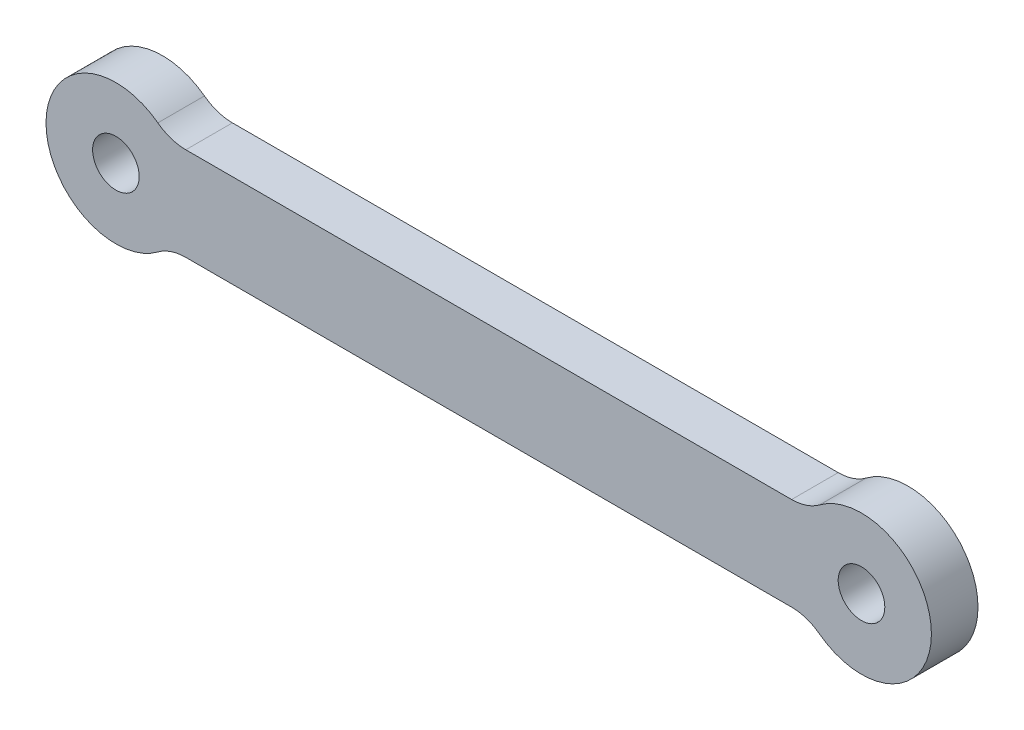
ISO-10303-21;
HEADER;
FILE_DESCRIPTION(('STEP AP214'),'2;1');
FILE_NAME('part.step','',(''),(''),'','','');
FILE_SCHEMA(('AUTOMOTIVE_DESIGN { 1 0 10303 214 1 1 1 1 }'));
ENDSEC;
DATA;
#1=APPLICATION_CONTEXT('core data for automotive mechanical design processes');
#2=APPLICATION_PROTOCOL_DEFINITION('international standard','automotive_design',2000,#1);
#3=PRODUCT_CONTEXT('',#1,'mechanical');
#4=PRODUCT('Part','Part','',(#3));
#5=PRODUCT_RELATED_PRODUCT_CATEGORY('part','',(#4));
#6=PRODUCT_DEFINITION_FORMATION('','',#4);
#7=PRODUCT_DEFINITION_CONTEXT('part definition',#1,'design');
#8=PRODUCT_DEFINITION('design','',#6,#7);
#9=PRODUCT_DEFINITION_SHAPE('','',#8);
#10=(LENGTH_UNIT() NAMED_UNIT(*) SI_UNIT(.MILLI.,.METRE.));
#11=(NAMED_UNIT(*) PLANE_ANGLE_UNIT() SI_UNIT($,.RADIAN.));
#12=(NAMED_UNIT(*) SI_UNIT($,.STERADIAN.) SOLID_ANGLE_UNIT());
#13=UNCERTAINTY_MEASURE_WITH_UNIT(LENGTH_MEASURE(1.E-05),#10,'distance_accuracy_value','');
#14=(GEOMETRIC_REPRESENTATION_CONTEXT(3) GLOBAL_UNCERTAINTY_ASSIGNED_CONTEXT((#13)) GLOBAL_UNIT_ASSIGNED_CONTEXT((#10,
#11,#12)) REPRESENTATION_CONTEXT('',''));
#15=CARTESIAN_POINT('',(0.,0.,0.));
#16=DIRECTION('',(0.,0.,1.));
#17=DIRECTION('',(1.,0.,0.));
#18=AXIS2_PLACEMENT_3D('',#15,#16,#17);
#19=CARTESIAN_POINT('',(-92.075,-12.7,3.175));
#20=DIRECTION('',(0.,0.,1.));
#21=DIRECTION('',(1.,0.,0.));
#22=AXIS2_PLACEMENT_3D('',#19,#20,#21);
#23=PLANE('',#22);
#24=CARTESIAN_POINT('',(0.,0.,3.175));
#25=DIRECTION('',(0.,0.,1.));
#26=DIRECTION('',(1.,0.,0.));
#27=AXIS2_PLACEMENT_3D('',#24,#25,#26);
#28=CIRCLE('',#27,3.175);
#29=CARTESIAN_POINT('',(3.175,0.,3.175));
#30=VERTEX_POINT('',#29);
#31=EDGE_CURVE('E134',#30,#30,#28,.T.);
#32=ORIENTED_EDGE('',*,*,#31,.F.);
#33=EDGE_LOOP('',(#32));
#34=FACE_BOUND('',#33,.T.);
#35=CARTESIAN_POINT('',(-92.075,-12.7,3.175));
#36=DIRECTION('',(0.,0.,-1.));
#37=DIRECTION('',(1.,0.,0.));
#38=AXIS2_PLACEMENT_3D('',#35,#36,#37);
#39=CIRCLE('',#38,6.35);
#40=CARTESIAN_POINT('',(-95.885,-7.62,3.175));
#41=VERTEX_POINT('',#40);
#42=CARTESIAN_POINT('',(-92.075,-6.35,3.175));
#43=VERTEX_POINT('',#42);
#44=EDGE_CURVE('E145',#41,#43,#39,.T.);
#45=ORIENTED_EDGE('',*,*,#44,.T.);
#46=DIRECTION('',(1.,0.,0.));
#47=VECTOR('',#46,1.);
#48=CARTESIAN_POINT('',(-9.525,-6.35,3.175));
#49=LINE('',#48,#47);
#50=CARTESIAN_POINT('',(-9.525,-6.35,3.175));
#51=VERTEX_POINT('',#50);
#52=EDGE_CURVE('E93',#43,#51,#49,.T.);
#53=ORIENTED_EDGE('',*,*,#52,.T.);
#54=CARTESIAN_POINT('',(-9.525,-12.7,3.175));
#55=DIRECTION('',(0.,0.,-1.));
#56=DIRECTION('',(-1.,0.,0.));
#57=AXIS2_PLACEMENT_3D('',#54,#55,#56);
#58=CIRCLE('',#57,6.35);
#59=CARTESIAN_POINT('',(-5.715,-7.62,3.175));
#60=VERTEX_POINT('',#59);
#61=EDGE_CURVE('E160',#51,#60,#58,.T.);
#62=ORIENTED_EDGE('',*,*,#61,.T.);
#63=CARTESIAN_POINT('',(0.,0.,3.175));
#64=DIRECTION('',(0.,0.,1.));
#65=DIRECTION('',(1.,0.,0.));
#66=AXIS2_PLACEMENT_3D('',#63,#64,#65);
#67=CIRCLE('',#66,9.525);
#68=CARTESIAN_POINT('',(-5.715,7.62,3.175));
#69=VERTEX_POINT('',#68);
#70=EDGE_CURVE('E173',#60,#69,#67,.T.);
#71=ORIENTED_EDGE('',*,*,#70,.T.);
#72=CARTESIAN_POINT('',(-9.525,12.7,3.175));
#73=DIRECTION('',(0.,0.,-1.));
#74=DIRECTION('',(1.,0.,0.));
#75=AXIS2_PLACEMENT_3D('',#72,#73,#74);
#76=CIRCLE('',#75,6.35);
#77=CARTESIAN_POINT('',(-9.525,6.35,3.175));
#78=VERTEX_POINT('',#77);
#79=EDGE_CURVE('E112',#69,#78,#76,.T.);
#80=ORIENTED_EDGE('',*,*,#79,.T.);
#81=DIRECTION('',(-1.,0.,0.));
#82=VECTOR('',#81,1.);
#83=CARTESIAN_POINT('',(-92.075,6.35,3.175));
#84=LINE('',#83,#82);
#85=CARTESIAN_POINT('',(-92.075,6.35,3.175));
#86=VERTEX_POINT('',#85);
#87=EDGE_CURVE('E106',#78,#86,#84,.T.);
#88=ORIENTED_EDGE('',*,*,#87,.T.);
#89=CARTESIAN_POINT('',(-92.075,12.7,3.175));
#90=DIRECTION('',(0.,0.,-1.));
#91=DIRECTION('',(-1.,0.,0.));
#92=AXIS2_PLACEMENT_3D('',#89,#90,#91);
#93=CIRCLE('',#92,6.35);
#94=CARTESIAN_POINT('',(-95.885,7.62,3.175));
#95=VERTEX_POINT('',#94);
#96=EDGE_CURVE('E110',#86,#95,#93,.T.);
#97=ORIENTED_EDGE('',*,*,#96,.T.);
#98=CARTESIAN_POINT('',(-101.6,0.,3.175));
#99=DIRECTION('',(0.,0.,1.));
#100=DIRECTION('',(1.,0.,0.));
#101=AXIS2_PLACEMENT_3D('',#98,#99,#100);
#102=CIRCLE('',#101,9.525);
#103=EDGE_CURVE('E50',#95,#41,#102,.T.);
#104=ORIENTED_EDGE('',*,*,#103,.T.);
#105=EDGE_LOOP('',(#45,#53,#62,#71,#80,#88,#97,#104));
#106=FACE_BOUND('',#105,.T.);
#107=CARTESIAN_POINT('',(-101.6,0.,3.175));
#108=DIRECTION('',(0.,0.,1.));
#109=DIRECTION('',(1.,0.,0.));
#110=AXIS2_PLACEMENT_3D('',#107,#108,#109);
#111=CIRCLE('',#110,3.175);
#112=CARTESIAN_POINT('',(-98.425,0.,3.175));
#113=VERTEX_POINT('',#112);
#114=EDGE_CURVE('E182',#113,#113,#111,.T.);
#115=ORIENTED_EDGE('',*,*,#114,.F.);
#116=EDGE_LOOP('',(#115));
#117=FACE_BOUND('',#116,.T.);
#118=ADVANCED_FACE('F33',(#34,#106,#117),#23,.T.);
#119=CARTESIAN_POINT('',(-92.075,-12.7,-3.175));
#120=DIRECTION('',(0.,0.,1.));
#121=DIRECTION('',(1.,0.,0.));
#122=AXIS2_PLACEMENT_3D('',#119,#120,#121);
#123=PLANE('',#122);
#124=CARTESIAN_POINT('',(-92.075,-12.7,-3.175));
#125=DIRECTION('',(0.,0.,-1.));
#126=DIRECTION('',(1.,0.,0.));
#127=AXIS2_PLACEMENT_3D('',#124,#125,#126);
#128=CIRCLE('',#127,6.35);
#129=CARTESIAN_POINT('',(-95.885,-7.62,-3.175));
#130=VERTEX_POINT('',#129);
#131=CARTESIAN_POINT('',(-92.075,-6.35,-3.175));
#132=VERTEX_POINT('',#131);
#133=EDGE_CURVE('E130',#130,#132,#128,.T.);
#134=ORIENTED_EDGE('',*,*,#133,.F.);
#135=CARTESIAN_POINT('',(-101.6,0.,-3.175));
#136=DIRECTION('',(0.,0.,1.));
#137=DIRECTION('',(1.,0.,0.));
#138=AXIS2_PLACEMENT_3D('',#135,#136,#137);
#139=CIRCLE('',#138,9.525);
#140=CARTESIAN_POINT('',(-95.885,7.62,-3.175));
#141=VERTEX_POINT('',#140);
#142=EDGE_CURVE('E85',#141,#130,#139,.T.);
#143=ORIENTED_EDGE('',*,*,#142,.F.);
#144=CARTESIAN_POINT('',(-92.075,12.7,-3.175));
#145=DIRECTION('',(0.,0.,-1.));
#146=DIRECTION('',(-1.,0.,0.));
#147=AXIS2_PLACEMENT_3D('',#144,#145,#146);
#148=CIRCLE('',#147,6.35);
#149=CARTESIAN_POINT('',(-92.075,6.35,-3.175));
#150=VERTEX_POINT('',#149);
#151=EDGE_CURVE('E79',#150,#141,#148,.T.);
#152=ORIENTED_EDGE('',*,*,#151,.F.);
#153=DIRECTION('',(-1.,0.,0.));
#154=VECTOR('',#153,1.);
#155=CARTESIAN_POINT('',(-92.075,6.35,-3.175));
#156=LINE('',#155,#154);
#157=CARTESIAN_POINT('',(-9.525,6.35,-3.175));
#158=VERTEX_POINT('',#157);
#159=EDGE_CURVE('E120',#158,#150,#156,.T.);
#160=ORIENTED_EDGE('',*,*,#159,.F.);
#161=CARTESIAN_POINT('',(-9.525,12.7,-3.175));
#162=DIRECTION('',(0.,0.,-1.));
#163=DIRECTION('',(1.,0.,0.));
#164=AXIS2_PLACEMENT_3D('',#161,#162,#163);
#165=CIRCLE('',#164,6.35);
#166=CARTESIAN_POINT('',(-5.715,7.62,-3.175));
#167=VERTEX_POINT('',#166);
#168=EDGE_CURVE('E140',#167,#158,#165,.T.);
#169=ORIENTED_EDGE('',*,*,#168,.F.);
#170=CARTESIAN_POINT('',(0.,0.,-3.175));
#171=DIRECTION('',(0.,0.,1.));
#172=DIRECTION('',(1.,0.,0.));
#173=AXIS2_PLACEMENT_3D('',#170,#171,#172);
#174=CIRCLE('',#173,9.525);
#175=CARTESIAN_POINT('',(-5.715,-7.62,-3.175));
#176=VERTEX_POINT('',#175);
#177=EDGE_CURVE('E138',#176,#167,#174,.T.);
#178=ORIENTED_EDGE('',*,*,#177,.F.);
#179=CARTESIAN_POINT('',(-9.525,-12.7,-3.175));
#180=DIRECTION('',(0.,0.,-1.));
#181=DIRECTION('',(-1.,0.,0.));
#182=AXIS2_PLACEMENT_3D('',#179,#180,#181);
#183=CIRCLE('',#182,6.35);
#184=CARTESIAN_POINT('',(-9.525,-6.35,-3.175));
#185=VERTEX_POINT('',#184);
#186=EDGE_CURVE('E136',#185,#176,#183,.T.);
#187=ORIENTED_EDGE('',*,*,#186,.F.);
#188=DIRECTION('',(1.,0.,0.));
#189=VECTOR('',#188,1.);
#190=CARTESIAN_POINT('',(-9.525,-6.35,-3.175));
#191=LINE('',#190,#189);
#192=EDGE_CURVE('E133',#132,#185,#191,.T.);
#193=ORIENTED_EDGE('',*,*,#192,.F.);
#194=EDGE_LOOP('',(#134,#143,#152,#160,#169,#178,#187,#193));
#195=FACE_BOUND('',#194,.T.);
#196=CARTESIAN_POINT('',(0.,0.,-3.175));
#197=DIRECTION('',(0.,0.,1.));
#198=DIRECTION('',(1.,0.,0.));
#199=AXIS2_PLACEMENT_3D('',#196,#197,#198);
#200=CIRCLE('',#199,3.175);
#201=CARTESIAN_POINT('',(3.175,0.,-3.175));
#202=VERTEX_POINT('',#201);
#203=EDGE_CURVE('E179',#202,#202,#200,.T.);
#204=ORIENTED_EDGE('',*,*,#203,.T.);
#205=EDGE_LOOP('',(#204));
#206=FACE_BOUND('',#205,.T.);
#207=CARTESIAN_POINT('',(-101.6,0.,-3.175));
#208=DIRECTION('',(0.,0.,1.));
#209=DIRECTION('',(1.,0.,0.));
#210=AXIS2_PLACEMENT_3D('',#207,#208,#209);
#211=CIRCLE('',#210,3.175);
#212=CARTESIAN_POINT('',(-98.425,0.,-3.175));
#213=VERTEX_POINT('',#212);
#214=EDGE_CURVE('E185',#213,#213,#211,.T.);
#215=ORIENTED_EDGE('',*,*,#214,.T.);
#216=EDGE_LOOP('',(#215));
#217=FACE_BOUND('',#216,.T.);
#218=ADVANCED_FACE('F164',(#195,#206,#217),#123,.F.);
#219=CARTESIAN_POINT('',(-92.075,-12.7,3.175));
#220=DIRECTION('',(0.,0.,-1.));
#221=DIRECTION('',(-1.,0.,0.));
#222=AXIS2_PLACEMENT_3D('',#219,#220,#221);
#223=CYLINDRICAL_SURFACE('',#222,6.35);
#224=ORIENTED_EDGE('',*,*,#133,.T.);
#225=DIRECTION('',(0.,0.,-1.));
#226=VECTOR('',#225,1.);
#227=CARTESIAN_POINT('',(-92.075,-6.35,3.175));
#228=LINE('',#227,#226);
#229=EDGE_CURVE('E11',#43,#132,#228,.T.);
#230=ORIENTED_EDGE('',*,*,#229,.F.);
#231=ORIENTED_EDGE('',*,*,#44,.F.);
#232=DIRECTION('',(0.,0.,-1.));
#233=VECTOR('',#232,1.);
#234=CARTESIAN_POINT('',(-95.885,-7.62,3.175));
#235=LINE('',#234,#233);
#236=EDGE_CURVE('E126',#41,#130,#235,.T.);
#237=ORIENTED_EDGE('',*,*,#236,.T.);
#238=EDGE_LOOP('',(#224,#230,#231,#237));
#239=FACE_BOUND('',#238,.T.);
#240=ADVANCED_FACE('F35',(#239),#223,.F.);
#241=CARTESIAN_POINT('',(-9.525,-6.35,3.175));
#242=DIRECTION('',(0.,1.,0.));
#243=DIRECTION('',(-1.,0.,0.));
#244=AXIS2_PLACEMENT_3D('',#241,#242,#243);
#245=PLANE('',#244);
#246=ORIENTED_EDGE('',*,*,#192,.T.);
#247=DIRECTION('',(0.,0.,-1.));
#248=VECTOR('',#247,1.);
#249=CARTESIAN_POINT('',(-9.525,-6.35,3.175));
#250=LINE('',#249,#248);
#251=EDGE_CURVE('E42',#51,#185,#250,.T.);
#252=ORIENTED_EDGE('',*,*,#251,.F.);
#253=ORIENTED_EDGE('',*,*,#52,.F.);
#254=ORIENTED_EDGE('',*,*,#229,.T.);
#255=EDGE_LOOP('',(#246,#252,#253,#254));
#256=FACE_BOUND('',#255,.T.);
#257=ADVANCED_FACE('F217',(#256),#245,.F.);
#258=CARTESIAN_POINT('',(-9.525,-12.7,3.175));
#259=DIRECTION('',(0.,0.,-1.));
#260=DIRECTION('',(-1.,0.,0.));
#261=AXIS2_PLACEMENT_3D('',#258,#259,#260);
#262=CYLINDRICAL_SURFACE('',#261,6.35);
#263=ORIENTED_EDGE('',*,*,#186,.T.);
#264=DIRECTION('',(0.,0.,-1.));
#265=VECTOR('',#264,1.);
#266=CARTESIAN_POINT('',(-5.715,-7.62,3.175));
#267=LINE('',#266,#265);
#268=EDGE_CURVE('E152',#60,#176,#267,.T.);
#269=ORIENTED_EDGE('',*,*,#268,.F.);
#270=ORIENTED_EDGE('',*,*,#61,.F.);
#271=ORIENTED_EDGE('',*,*,#251,.T.);
#272=EDGE_LOOP('',(#263,#269,#270,#271));
#273=FACE_BOUND('',#272,.T.);
#274=ADVANCED_FACE('F158',(#273),#262,.F.);
#275=CARTESIAN_POINT('',(0.,0.,3.175));
#276=DIRECTION('',(0.,0.,-1.));
#277=DIRECTION('',(-1.,0.,0.));
#278=AXIS2_PLACEMENT_3D('',#275,#276,#277);
#279=CYLINDRICAL_SURFACE('',#278,9.525);
#280=ORIENTED_EDGE('',*,*,#177,.T.);
#281=DIRECTION('',(0.,0.,-1.));
#282=VECTOR('',#281,1.);
#283=CARTESIAN_POINT('',(-5.715,7.62,3.175));
#284=LINE('',#283,#282);
#285=EDGE_CURVE('E149',#69,#167,#284,.T.);
#286=ORIENTED_EDGE('',*,*,#285,.F.);
#287=ORIENTED_EDGE('',*,*,#70,.F.);
#288=ORIENTED_EDGE('',*,*,#268,.T.);
#289=EDGE_LOOP('',(#280,#286,#287,#288));
#290=FACE_BOUND('',#289,.T.);
#291=ADVANCED_FACE('F169',(#290),#279,.T.);
#292=CARTESIAN_POINT('',(-9.525,12.7,3.175));
#293=DIRECTION('',(0.,0.,-1.));
#294=DIRECTION('',(-1.,0.,0.));
#295=AXIS2_PLACEMENT_3D('',#292,#293,#294);
#296=CYLINDRICAL_SURFACE('',#295,6.35);
#297=ORIENTED_EDGE('',*,*,#168,.T.);
#298=DIRECTION('',(0.,0.,-1.));
#299=VECTOR('',#298,1.);
#300=CARTESIAN_POINT('',(-9.525,6.35,3.175));
#301=LINE('',#300,#299);
#302=EDGE_CURVE('E121',#78,#158,#301,.T.);
#303=ORIENTED_EDGE('',*,*,#302,.F.);
#304=ORIENTED_EDGE('',*,*,#79,.F.);
#305=ORIENTED_EDGE('',*,*,#285,.T.);
#306=EDGE_LOOP('',(#297,#303,#304,#305));
#307=FACE_BOUND('',#306,.T.);
#308=ADVANCED_FACE('F172',(#307),#296,.F.);
#309=CARTESIAN_POINT('',(-92.075,6.35,3.175));
#310=DIRECTION('',(0.,-1.,0.));
#311=DIRECTION('',(1.,0.,0.));
#312=AXIS2_PLACEMENT_3D('',#309,#310,#311);
#313=PLANE('',#312);
#314=ORIENTED_EDGE('',*,*,#159,.T.);
#315=DIRECTION('',(0.,0.,-1.));
#316=VECTOR('',#315,1.);
#317=CARTESIAN_POINT('',(-92.075,6.35,3.175));
#318=LINE('',#317,#316);
#319=EDGE_CURVE('E117',#86,#150,#318,.T.);
#320=ORIENTED_EDGE('',*,*,#319,.F.);
#321=ORIENTED_EDGE('',*,*,#87,.F.);
#322=ORIENTED_EDGE('',*,*,#302,.T.);
#323=EDGE_LOOP('',(#314,#320,#321,#322));
#324=FACE_BOUND('',#323,.T.);
#325=ADVANCED_FACE('F118',(#324),#313,.F.);
#326=CARTESIAN_POINT('',(-92.075,12.7,3.175));
#327=DIRECTION('',(0.,0.,-1.));
#328=DIRECTION('',(-1.,0.,0.));
#329=AXIS2_PLACEMENT_3D('',#326,#327,#328);
#330=CYLINDRICAL_SURFACE('',#329,6.35);
#331=ORIENTED_EDGE('',*,*,#151,.T.);
#332=DIRECTION('',(0.,0.,-1.));
#333=VECTOR('',#332,1.);
#334=CARTESIAN_POINT('',(-95.885,7.62,3.175));
#335=LINE('',#334,#333);
#336=EDGE_CURVE('E122',#95,#141,#335,.T.);
#337=ORIENTED_EDGE('',*,*,#336,.F.);
#338=ORIENTED_EDGE('',*,*,#96,.F.);
#339=ORIENTED_EDGE('',*,*,#319,.T.);
#340=EDGE_LOOP('',(#331,#337,#338,#339));
#341=FACE_BOUND('',#340,.T.);
#342=ADVANCED_FACE('F124',(#341),#330,.F.);
#343=CARTESIAN_POINT('',(-101.6,0.,3.175));
#344=DIRECTION('',(0.,0.,-1.));
#345=DIRECTION('',(-1.,0.,0.));
#346=AXIS2_PLACEMENT_3D('',#343,#344,#345);
#347=CYLINDRICAL_SURFACE('',#346,9.525);
#348=ORIENTED_EDGE('',*,*,#142,.T.);
#349=ORIENTED_EDGE('',*,*,#236,.F.);
#350=ORIENTED_EDGE('',*,*,#103,.F.);
#351=ORIENTED_EDGE('',*,*,#336,.T.);
#352=EDGE_LOOP('',(#348,#349,#350,#351));
#353=FACE_BOUND('',#352,.T.);
#354=ADVANCED_FACE('F205',(#353),#347,.T.);
#355=CARTESIAN_POINT('',(0.,0.,3.175));
#356=DIRECTION('',(0.,0.,-1.));
#357=DIRECTION('',(-1.,0.,0.));
#358=AXIS2_PLACEMENT_3D('',#355,#356,#357);
#359=CYLINDRICAL_SURFACE('',#358,3.175);
#360=ORIENTED_EDGE('',*,*,#31,.T.);
#361=EDGE_LOOP('',(#360));
#362=FACE_BOUND('',#361,.T.);
#363=ORIENTED_EDGE('',*,*,#203,.F.);
#364=EDGE_LOOP('',(#363));
#365=FACE_BOUND('',#364,.T.);
#366=ADVANCED_FACE('F202',(#362,#365),#359,.F.);
#367=CARTESIAN_POINT('',(-101.6,0.,3.175));
#368=DIRECTION('',(0.,0.,-1.));
#369=DIRECTION('',(-1.,0.,0.));
#370=AXIS2_PLACEMENT_3D('',#367,#368,#369);
#371=CYLINDRICAL_SURFACE('',#370,3.175);
#372=ORIENTED_EDGE('',*,*,#114,.T.);
#373=EDGE_LOOP('',(#372));
#374=FACE_BOUND('',#373,.T.);
#375=ORIENTED_EDGE('',*,*,#214,.F.);
#376=EDGE_LOOP('',(#375));
#377=FACE_BOUND('',#376,.T.);
#378=ADVANCED_FACE('F191',(#374,#377),#371,.F.);
#379=CLOSED_SHELL('',(#118,#218,#240,#257,#274,#291,#308,#325,#342,#354,#366,#378));
#380=MANIFOLD_SOLID_BREP('B2',#379);
#381=ADVANCED_BREP_SHAPE_REPRESENTATION('',(#18,#380),#14);
#382=SHAPE_DEFINITION_REPRESENTATION(#9,#381);
ENDSEC;
END-ISO-10303-21;
